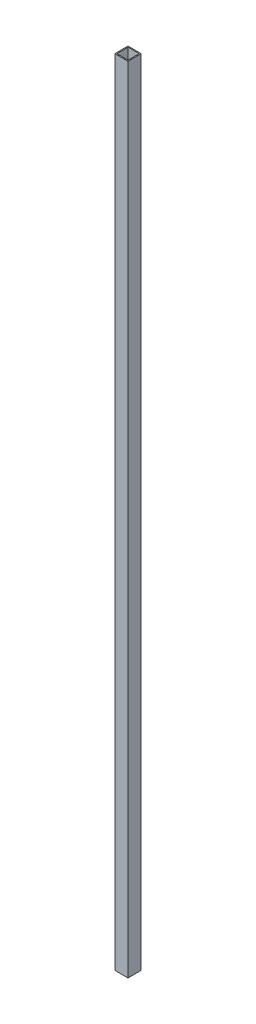
ISO-10303-21;
HEADER;
FILE_DESCRIPTION(('STEP AP214'),'2;1');
FILE_NAME('part.step','',(''),(''),'','','');
FILE_SCHEMA(('AUTOMOTIVE_DESIGN { 1 0 10303 214 1 1 1 1 }'));
ENDSEC;
DATA;
#1=APPLICATION_CONTEXT('core data for automotive mechanical design processes');
#2=APPLICATION_PROTOCOL_DEFINITION('international standard','automotive_design',2000,#1);
#3=PRODUCT_CONTEXT('',#1,'mechanical');
#4=PRODUCT('Part','Part','',(#3));
#5=PRODUCT_RELATED_PRODUCT_CATEGORY('part','',(#4));
#6=PRODUCT_DEFINITION_FORMATION('','',#4);
#7=PRODUCT_DEFINITION_CONTEXT('part definition',#1,'design');
#8=PRODUCT_DEFINITION('design','',#6,#7);
#9=PRODUCT_DEFINITION_SHAPE('','',#8);
#10=(LENGTH_UNIT() NAMED_UNIT(*) SI_UNIT(.MILLI.,.METRE.));
#11=(NAMED_UNIT(*) PLANE_ANGLE_UNIT() SI_UNIT($,.RADIAN.));
#12=(NAMED_UNIT(*) SI_UNIT($,.STERADIAN.) SOLID_ANGLE_UNIT());
#13=UNCERTAINTY_MEASURE_WITH_UNIT(LENGTH_MEASURE(1.E-05),#10,'distance_accuracy_value','');
#14=(GEOMETRIC_REPRESENTATION_CONTEXT(3) GLOBAL_UNCERTAINTY_ASSIGNED_CONTEXT((#13)) GLOBAL_UNIT_ASSIGNED_CONTEXT((#10,
#11,#12)) REPRESENTATION_CONTEXT('',''));
#15=CARTESIAN_POINT('',(0.,0.,0.));
#16=DIRECTION('',(0.,0.,1.));
#17=DIRECTION('',(1.,0.,0.));
#18=AXIS2_PLACEMENT_3D('',#15,#16,#17);
#19=CARTESIAN_POINT('',(0.,762.,0.));
#20=DIRECTION('',(0.,-1.,0.));
#21=DIRECTION('',(0.,0.,-1.));
#22=AXIS2_PLACEMENT_3D('',#19,#20,#21);
#23=PLANE('',#22);
#24=DIRECTION('',(0.,0.,-1.));
#25=VECTOR('',#24,1.);
#26=CARTESIAN_POINT('',(12.7,762.,12.7));
#27=LINE('',#26,#25);
#28=CARTESIAN_POINT('',(12.7,762.,12.7));
#29=VERTEX_POINT('',#28);
#30=CARTESIAN_POINT('',(12.7,762.,-12.7));
#31=VERTEX_POINT('',#30);
#32=EDGE_CURVE('E153',#29,#31,#27,.T.);
#33=ORIENTED_EDGE('',*,*,#32,.T.);
#34=DIRECTION('',(-1.,0.,0.));
#35=VECTOR('',#34,1.);
#36=CARTESIAN_POINT('',(-12.7,762.,-12.7));
#37=LINE('',#36,#35);
#38=CARTESIAN_POINT('',(-12.7,762.,-12.7));
#39=VERTEX_POINT('',#38);
#40=EDGE_CURVE('E157',#31,#39,#37,.T.);
#41=ORIENTED_EDGE('',*,*,#40,.T.);
#42=DIRECTION('',(0.,0.,1.));
#43=VECTOR('',#42,1.);
#44=CARTESIAN_POINT('',(-12.7,762.,12.7));
#45=LINE('',#44,#43);
#46=CARTESIAN_POINT('',(-12.7,762.,12.7));
#47=VERTEX_POINT('',#46);
#48=EDGE_CURVE('E161',#39,#47,#45,.T.);
#49=ORIENTED_EDGE('',*,*,#48,.T.);
#50=DIRECTION('',(1.,0.,0.));
#51=VECTOR('',#50,1.);
#52=CARTESIAN_POINT('',(-12.7,762.,12.7));
#53=LINE('',#52,#51);
#54=EDGE_CURVE('E164',#47,#29,#53,.T.);
#55=ORIENTED_EDGE('',*,*,#54,.T.);
#56=EDGE_LOOP('',(#33,#41,#49,#55));
#57=FACE_BOUND('',#56,.T.);
#58=DIRECTION('',(0.,0.,1.));
#59=VECTOR('',#58,1.);
#60=CARTESIAN_POINT('',(-10.795,762.,10.795));
#61=LINE('',#60,#59);
#62=CARTESIAN_POINT('',(-10.795,762.,-10.795));
#63=VERTEX_POINT('',#62);
#64=CARTESIAN_POINT('',(-10.795,762.,10.795));
#65=VERTEX_POINT('',#64);
#66=EDGE_CURVE('E105',#63,#65,#61,.T.);
#67=ORIENTED_EDGE('',*,*,#66,.F.);
#68=DIRECTION('',(-1.,0.,0.));
#69=VECTOR('',#68,1.);
#70=CARTESIAN_POINT('',(-10.795,762.,-10.795));
#71=LINE('',#70,#69);
#72=CARTESIAN_POINT('',(10.795,762.,-10.795));
#73=VERTEX_POINT('',#72);
#74=EDGE_CURVE('E131',#73,#63,#71,.T.);
#75=ORIENTED_EDGE('',*,*,#74,.F.);
#76=DIRECTION('',(0.,0.,-1.));
#77=VECTOR('',#76,1.);
#78=CARTESIAN_POINT('',(10.795,762.,10.795));
#79=LINE('',#78,#77);
#80=CARTESIAN_POINT('',(10.795,762.,10.795));
#81=VERTEX_POINT('',#80);
#82=EDGE_CURVE('E127',#81,#73,#79,.T.);
#83=ORIENTED_EDGE('',*,*,#82,.F.);
#84=DIRECTION('',(1.,0.,0.));
#85=VECTOR('',#84,1.);
#86=CARTESIAN_POINT('',(-10.795,762.,10.795));
#87=LINE('',#86,#85);
#88=EDGE_CURVE('E114',#65,#81,#87,.T.);
#89=ORIENTED_EDGE('',*,*,#88,.F.);
#90=EDGE_LOOP('',(#67,#75,#83,#89));
#91=FACE_BOUND('',#90,.T.);
#92=ADVANCED_FACE('F39',(#57,#91),#23,.F.);
#93=CARTESIAN_POINT('',(0.,-762.,0.));
#94=DIRECTION('',(0.,-1.,0.));
#95=DIRECTION('',(0.,0.,-1.));
#96=AXIS2_PLACEMENT_3D('',#93,#94,#95);
#97=PLANE('',#96);
#98=DIRECTION('',(0.,0.,-1.));
#99=VECTOR('',#98,1.);
#100=CARTESIAN_POINT('',(12.7,-762.,12.7));
#101=LINE('',#100,#99);
#102=CARTESIAN_POINT('',(12.7,-762.,12.7));
#103=VERTEX_POINT('',#102);
#104=CARTESIAN_POINT('',(12.7,-762.,-12.7));
#105=VERTEX_POINT('',#104);
#106=EDGE_CURVE('E123',#103,#105,#101,.T.);
#107=ORIENTED_EDGE('',*,*,#106,.F.);
#108=DIRECTION('',(1.,0.,0.));
#109=VECTOR('',#108,1.);
#110=CARTESIAN_POINT('',(-12.7,-762.,12.7));
#111=LINE('',#110,#109);
#112=CARTESIAN_POINT('',(-12.7,-762.,12.7));
#113=VERTEX_POINT('',#112);
#114=EDGE_CURVE('E158',#113,#103,#111,.T.);
#115=ORIENTED_EDGE('',*,*,#114,.F.);
#116=DIRECTION('',(0.,0.,1.));
#117=VECTOR('',#116,1.);
#118=CARTESIAN_POINT('',(-12.7,-762.,12.7));
#119=LINE('',#118,#117);
#120=CARTESIAN_POINT('',(-12.7,-762.,-12.7));
#121=VERTEX_POINT('',#120);
#122=EDGE_CURVE('E174',#121,#113,#119,.T.);
#123=ORIENTED_EDGE('',*,*,#122,.F.);
#124=DIRECTION('',(-1.,0.,0.));
#125=VECTOR('',#124,1.);
#126=CARTESIAN_POINT('',(-12.7,-762.,-12.7));
#127=LINE('',#126,#125);
#128=EDGE_CURVE('E171',#105,#121,#127,.T.);
#129=ORIENTED_EDGE('',*,*,#128,.F.);
#130=EDGE_LOOP('',(#107,#115,#123,#129));
#131=FACE_BOUND('',#130,.T.);
#132=DIRECTION('',(-1.,0.,0.));
#133=VECTOR('',#132,1.);
#134=CARTESIAN_POINT('',(-10.795,-762.,-10.795));
#135=LINE('',#134,#133);
#136=CARTESIAN_POINT('',(10.795,-762.,-10.795));
#137=VERTEX_POINT('',#136);
#138=CARTESIAN_POINT('',(-10.795,-762.,-10.795));
#139=VERTEX_POINT('',#138);
#140=EDGE_CURVE('E115',#137,#139,#135,.T.);
#141=ORIENTED_EDGE('',*,*,#140,.T.);
#142=DIRECTION('',(0.,0.,1.));
#143=VECTOR('',#142,1.);
#144=CARTESIAN_POINT('',(-10.795,-762.,10.795));
#145=LINE('',#144,#143);
#146=CARTESIAN_POINT('',(-10.795,-762.,10.795));
#147=VERTEX_POINT('',#146);
#148=EDGE_CURVE('E63',#139,#147,#145,.T.);
#149=ORIENTED_EDGE('',*,*,#148,.T.);
#150=DIRECTION('',(1.,0.,0.));
#151=VECTOR('',#150,1.);
#152=CARTESIAN_POINT('',(-10.795,-762.,10.795));
#153=LINE('',#152,#151);
#154=CARTESIAN_POINT('',(10.795,-762.,10.795));
#155=VERTEX_POINT('',#154);
#156=EDGE_CURVE('E121',#147,#155,#153,.T.);
#157=ORIENTED_EDGE('',*,*,#156,.T.);
#158=DIRECTION('',(0.,0.,-1.));
#159=VECTOR('',#158,1.);
#160=CARTESIAN_POINT('',(10.795,-762.,10.795));
#161=LINE('',#160,#159);
#162=EDGE_CURVE('E140',#155,#137,#161,.T.);
#163=ORIENTED_EDGE('',*,*,#162,.T.);
#164=EDGE_LOOP('',(#141,#149,#157,#163));
#165=FACE_BOUND('',#164,.T.);
#166=ADVANCED_FACE('F197',(#131,#165),#97,.T.);
#167=CARTESIAN_POINT('',(12.7,762.,12.7));
#168=DIRECTION('',(-1.,0.,0.));
#169=DIRECTION('',(0.,0.,1.));
#170=AXIS2_PLACEMENT_3D('',#167,#168,#169);
#171=PLANE('',#170);
#172=ORIENTED_EDGE('',*,*,#106,.T.);
#173=DIRECTION('',(0.,-1.,0.));
#174=VECTOR('',#173,1.);
#175=CARTESIAN_POINT('',(12.7,762.,-12.7));
#176=LINE('',#175,#174);
#177=EDGE_CURVE('E11',#31,#105,#176,.T.);
#178=ORIENTED_EDGE('',*,*,#177,.F.);
#179=ORIENTED_EDGE('',*,*,#32,.F.);
#180=DIRECTION('',(0.,-1.,0.));
#181=VECTOR('',#180,1.);
#182=CARTESIAN_POINT('',(12.7,762.,12.7));
#183=LINE('',#182,#181);
#184=EDGE_CURVE('E167',#29,#103,#183,.T.);
#185=ORIENTED_EDGE('',*,*,#184,.T.);
#186=EDGE_LOOP('',(#172,#178,#179,#185));
#187=FACE_BOUND('',#186,.T.);
#188=ADVANCED_FACE('F41',(#187),#171,.F.);
#189=CARTESIAN_POINT('',(-12.7,762.,-12.7));
#190=DIRECTION('',(0.,0.,1.));
#191=DIRECTION('',(1.,0.,0.));
#192=AXIS2_PLACEMENT_3D('',#189,#190,#191);
#193=PLANE('',#192);
#194=ORIENTED_EDGE('',*,*,#128,.T.);
#195=DIRECTION('',(0.,-1.,0.));
#196=VECTOR('',#195,1.);
#197=CARTESIAN_POINT('',(-12.7,762.,-12.7));
#198=LINE('',#197,#196);
#199=EDGE_CURVE('E48',#39,#121,#198,.T.);
#200=ORIENTED_EDGE('',*,*,#199,.F.);
#201=ORIENTED_EDGE('',*,*,#40,.F.);
#202=ORIENTED_EDGE('',*,*,#177,.T.);
#203=EDGE_LOOP('',(#194,#200,#201,#202));
#204=FACE_BOUND('',#203,.T.);
#205=ADVANCED_FACE('F207',(#204),#193,.F.);
#206=CARTESIAN_POINT('',(-12.7,762.,12.7));
#207=DIRECTION('',(1.,0.,0.));
#208=DIRECTION('',(0.,0.,-1.));
#209=AXIS2_PLACEMENT_3D('',#206,#207,#208);
#210=PLANE('',#209);
#211=ORIENTED_EDGE('',*,*,#122,.T.);
#212=DIRECTION('',(0.,-1.,0.));
#213=VECTOR('',#212,1.);
#214=CARTESIAN_POINT('',(-12.7,762.,12.7));
#215=LINE('',#214,#213);
#216=EDGE_CURVE('E182',#47,#113,#215,.T.);
#217=ORIENTED_EDGE('',*,*,#216,.F.);
#218=ORIENTED_EDGE('',*,*,#48,.F.);
#219=ORIENTED_EDGE('',*,*,#199,.T.);
#220=EDGE_LOOP('',(#211,#217,#218,#219));
#221=FACE_BOUND('',#220,.T.);
#222=ADVANCED_FACE('F191',(#221),#210,.F.);
#223=CARTESIAN_POINT('',(-12.7,762.,12.7));
#224=DIRECTION('',(0.,0.,-1.));
#225=DIRECTION('',(-1.,0.,0.));
#226=AXIS2_PLACEMENT_3D('',#223,#224,#225);
#227=PLANE('',#226);
#228=ORIENTED_EDGE('',*,*,#114,.T.);
#229=ORIENTED_EDGE('',*,*,#184,.F.);
#230=ORIENTED_EDGE('',*,*,#54,.F.);
#231=ORIENTED_EDGE('',*,*,#216,.T.);
#232=EDGE_LOOP('',(#228,#229,#230,#231));
#233=FACE_BOUND('',#232,.T.);
#234=ADVANCED_FACE('F201',(#233),#227,.F.);
#235=CARTESIAN_POINT('',(-10.795,762.,10.795));
#236=DIRECTION('',(1.,0.,0.));
#237=DIRECTION('',(0.,0.,-1.));
#238=AXIS2_PLACEMENT_3D('',#235,#236,#237);
#239=PLANE('',#238);
#240=ORIENTED_EDGE('',*,*,#148,.F.);
#241=DIRECTION('',(0.,-1.,0.));
#242=VECTOR('',#241,1.);
#243=CARTESIAN_POINT('',(-10.795,762.,-10.795));
#244=LINE('',#243,#242);
#245=EDGE_CURVE('E109',#63,#139,#244,.T.);
#246=ORIENTED_EDGE('',*,*,#245,.F.);
#247=ORIENTED_EDGE('',*,*,#66,.T.);
#248=DIRECTION('',(0.,-1.,0.));
#249=VECTOR('',#248,1.);
#250=CARTESIAN_POINT('',(-10.795,762.,10.795));
#251=LINE('',#250,#249);
#252=EDGE_CURVE('E108',#65,#147,#251,.T.);
#253=ORIENTED_EDGE('',*,*,#252,.T.);
#254=EDGE_LOOP('',(#240,#246,#247,#253));
#255=FACE_BOUND('',#254,.T.);
#256=ADVANCED_FACE('F107',(#255),#239,.T.);
#257=CARTESIAN_POINT('',(-10.795,762.,10.795));
#258=DIRECTION('',(0.,0.,-1.));
#259=DIRECTION('',(-1.,0.,0.));
#260=AXIS2_PLACEMENT_3D('',#257,#258,#259);
#261=PLANE('',#260);
#262=ORIENTED_EDGE('',*,*,#156,.F.);
#263=ORIENTED_EDGE('',*,*,#252,.F.);
#264=ORIENTED_EDGE('',*,*,#88,.T.);
#265=DIRECTION('',(0.,-1.,0.));
#266=VECTOR('',#265,1.);
#267=CARTESIAN_POINT('',(10.795,762.,10.795));
#268=LINE('',#267,#266);
#269=EDGE_CURVE('E124',#81,#155,#268,.T.);
#270=ORIENTED_EDGE('',*,*,#269,.T.);
#271=EDGE_LOOP('',(#262,#263,#264,#270));
#272=FACE_BOUND('',#271,.T.);
#273=ADVANCED_FACE('F118',(#272),#261,.T.);
#274=CARTESIAN_POINT('',(10.795,762.,10.795));
#275=DIRECTION('',(-1.,0.,0.));
#276=DIRECTION('',(0.,0.,1.));
#277=AXIS2_PLACEMENT_3D('',#274,#275,#276);
#278=PLANE('',#277);
#279=ORIENTED_EDGE('',*,*,#162,.F.);
#280=ORIENTED_EDGE('',*,*,#269,.F.);
#281=ORIENTED_EDGE('',*,*,#82,.T.);
#282=DIRECTION('',(0.,-1.,0.));
#283=VECTOR('',#282,1.);
#284=CARTESIAN_POINT('',(10.795,762.,-10.795));
#285=LINE('',#284,#283);
#286=EDGE_CURVE('E55',#73,#137,#285,.T.);
#287=ORIENTED_EDGE('',*,*,#286,.T.);
#288=EDGE_LOOP('',(#279,#280,#281,#287));
#289=FACE_BOUND('',#288,.T.);
#290=ADVANCED_FACE('F230',(#289),#278,.T.);
#291=CARTESIAN_POINT('',(-10.795,762.,-10.795));
#292=DIRECTION('',(0.,0.,1.));
#293=DIRECTION('',(1.,0.,0.));
#294=AXIS2_PLACEMENT_3D('',#291,#292,#293);
#295=PLANE('',#294);
#296=ORIENTED_EDGE('',*,*,#140,.F.);
#297=ORIENTED_EDGE('',*,*,#286,.F.);
#298=ORIENTED_EDGE('',*,*,#74,.T.);
#299=ORIENTED_EDGE('',*,*,#245,.T.);
#300=EDGE_LOOP('',(#296,#297,#298,#299));
#301=FACE_BOUND('',#300,.T.);
#302=ADVANCED_FACE('F234',(#301),#295,.T.);
#303=CLOSED_SHELL('',(#92,#166,#188,#205,#222,#234,#256,#273,#290,#302));
#304=MANIFOLD_SOLID_BREP('B2',#303);
#305=ADVANCED_BREP_SHAPE_REPRESENTATION('',(#18,#304),#14);
#306=SHAPE_DEFINITION_REPRESENTATION(#9,#305);
ENDSEC;
END-ISO-10303-21;
